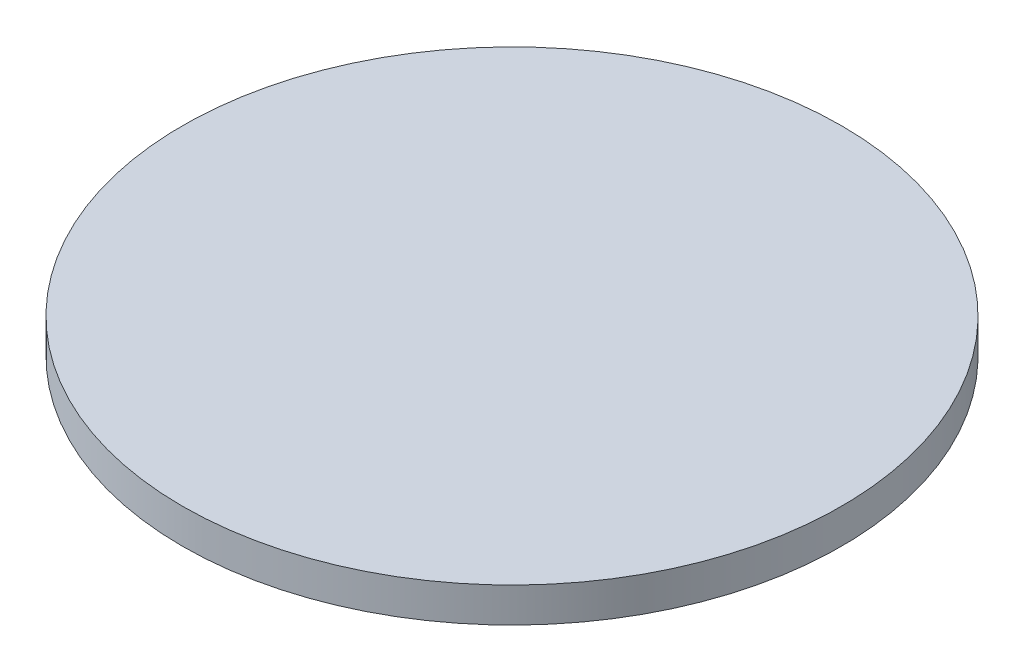
ISO-10303-21;
HEADER;
FILE_DESCRIPTION(('STEP AP214'),'2;1');
FILE_NAME('part.step','',(''),(''),'','','');
FILE_SCHEMA(('AUTOMOTIVE_DESIGN { 1 0 10303 214 1 1 1 1 }'));
ENDSEC;
DATA;
#1=APPLICATION_CONTEXT('core data for automotive mechanical design processes');
#2=APPLICATION_PROTOCOL_DEFINITION('international standard','automotive_design',2000,#1);
#3=PRODUCT_CONTEXT('',#1,'mechanical');
#4=PRODUCT('Part','Part','',(#3));
#5=PRODUCT_RELATED_PRODUCT_CATEGORY('part','',(#4));
#6=PRODUCT_DEFINITION_FORMATION('','',#4);
#7=PRODUCT_DEFINITION_CONTEXT('part definition',#1,'design');
#8=PRODUCT_DEFINITION('design','',#6,#7);
#9=PRODUCT_DEFINITION_SHAPE('','',#8);
#10=(LENGTH_UNIT() NAMED_UNIT(*) SI_UNIT(.MILLI.,.METRE.));
#11=(NAMED_UNIT(*) PLANE_ANGLE_UNIT() SI_UNIT($,.RADIAN.));
#12=(NAMED_UNIT(*) SI_UNIT($,.STERADIAN.) SOLID_ANGLE_UNIT());
#13=UNCERTAINTY_MEASURE_WITH_UNIT(LENGTH_MEASURE(1.E-05),#10,'distance_accuracy_value','');
#14=(GEOMETRIC_REPRESENTATION_CONTEXT(3) GLOBAL_UNCERTAINTY_ASSIGNED_CONTEXT((#13)) GLOBAL_UNIT_ASSIGNED_CONTEXT((#10,
#11,#12)) REPRESENTATION_CONTEXT('',''));
#15=CARTESIAN_POINT('',(0.,0.,0.));
#16=DIRECTION('',(0.,0.,1.));
#17=DIRECTION('',(1.,0.,0.));
#18=AXIS2_PLACEMENT_3D('',#15,#16,#17);
#19=CARTESIAN_POINT('',(0.,1.5,0.));
#20=DIRECTION('',(0.,-1.,0.));
#21=DIRECTION('',(0.,0.,-1.));
#22=AXIS2_PLACEMENT_3D('',#19,#20,#21);
#23=CYLINDRICAL_SURFACE('',#22,14.25);
#24=CARTESIAN_POINT('',(0.,1.5,0.));
#25=DIRECTION('',(0.,1.,0.));
#26=DIRECTION('',(0.,0.,1.));
#27=AXIS2_PLACEMENT_3D('',#24,#25,#26);
#28=CIRCLE('',#27,14.25);
#29=CARTESIAN_POINT('',(0.,1.5,14.25));
#30=VERTEX_POINT('',#29);
#31=EDGE_CURVE('E10',#30,#30,#28,.T.);
#32=ORIENTED_EDGE('',*,*,#31,.F.);
#33=EDGE_LOOP('',(#32));
#34=FACE_BOUND('',#33,.T.);
#35=CARTESIAN_POINT('',(0.,0.,0.));
#36=DIRECTION('',(0.,1.,0.));
#37=DIRECTION('',(0.,0.,1.));
#38=AXIS2_PLACEMENT_3D('',#35,#36,#37);
#39=CIRCLE('',#38,14.25);
#40=CARTESIAN_POINT('',(0.,0.,14.25));
#41=VERTEX_POINT('',#40);
#42=EDGE_CURVE('E44',#41,#41,#39,.T.);
#43=ORIENTED_EDGE('',*,*,#42,.T.);
#44=EDGE_LOOP('',(#43));
#45=FACE_BOUND('',#44,.T.);
#46=ADVANCED_FACE('F41',(#34,#45),#23,.T.);
#47=CARTESIAN_POINT('',(0.,1.5,0.));
#48=DIRECTION('',(0.,1.,0.));
#49=DIRECTION('',(0.,0.,1.));
#50=AXIS2_PLACEMENT_3D('',#47,#48,#49);
#51=PLANE('',#50);
#52=ORIENTED_EDGE('',*,*,#31,.T.);
#53=EDGE_LOOP('',(#52));
#54=FACE_BOUND('',#53,.T.);
#55=ADVANCED_FACE('F58',(#54),#51,.T.);
#56=CARTESIAN_POINT('',(0.,0.,0.));
#57=DIRECTION('',(0.,1.,0.));
#58=DIRECTION('',(0.,0.,1.));
#59=AXIS2_PLACEMENT_3D('',#56,#57,#58);
#60=PLANE('',#59);
#61=ORIENTED_EDGE('',*,*,#42,.F.);
#62=EDGE_LOOP('',(#61));
#63=FACE_BOUND('',#62,.T.);
#64=ADVANCED_FACE('F56',(#63),#60,.F.);
#65=CLOSED_SHELL('',(#46,#55,#64));
#66=MANIFOLD_SOLID_BREP('B2',#65);
#67=ADVANCED_BREP_SHAPE_REPRESENTATION('',(#18,#66),#14);
#68=SHAPE_DEFINITION_REPRESENTATION(#9,#67);
ENDSEC;
END-ISO-10303-21;
